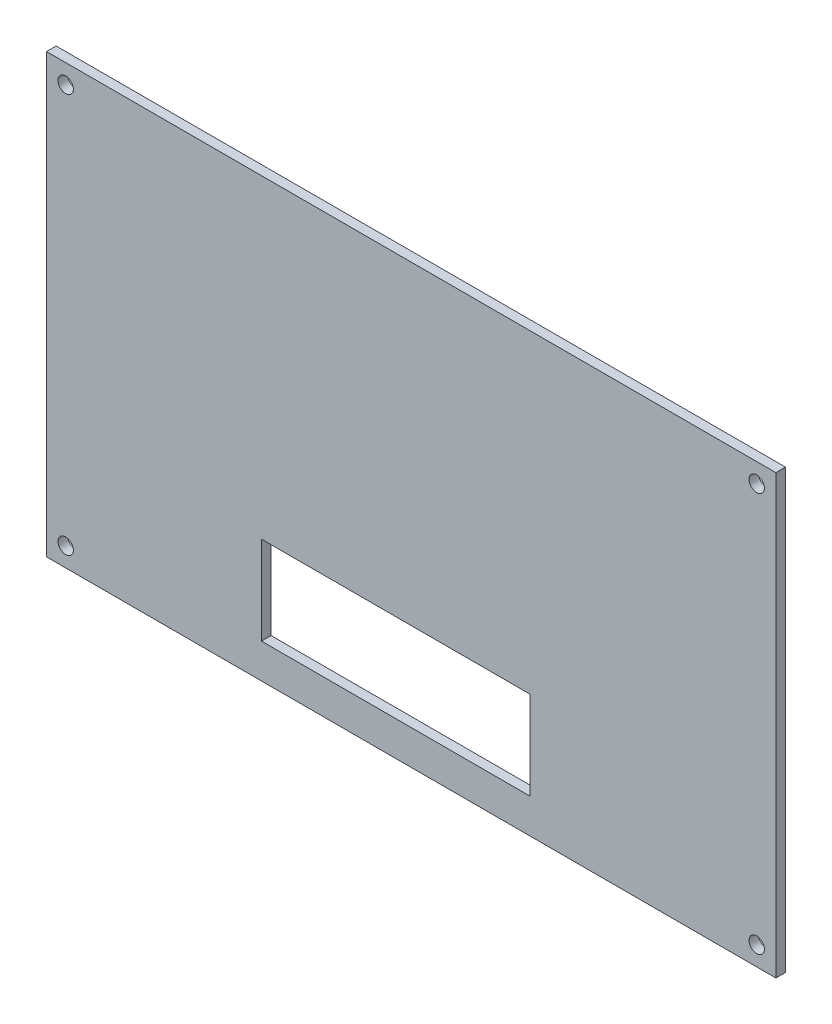
ISO-10303-21;
HEADER;
FILE_DESCRIPTION(('STEP AP214'),'2;1');
FILE_NAME('part.step','',(''),(''),'','','');
FILE_SCHEMA(('AUTOMOTIVE_DESIGN { 1 0 10303 214 1 1 1 1 }'));
ENDSEC;
DATA;
#1=APPLICATION_CONTEXT('core data for automotive mechanical design processes');
#2=APPLICATION_PROTOCOL_DEFINITION('international standard','automotive_design',2000,#1);
#3=PRODUCT_CONTEXT('',#1,'mechanical');
#4=PRODUCT('Part','Part','',(#3));
#5=PRODUCT_RELATED_PRODUCT_CATEGORY('part','',(#4));
#6=PRODUCT_DEFINITION_FORMATION('','',#4);
#7=PRODUCT_DEFINITION_CONTEXT('part definition',#1,'design');
#8=PRODUCT_DEFINITION('design','',#6,#7);
#9=PRODUCT_DEFINITION_SHAPE('','',#8);
#10=(LENGTH_UNIT() NAMED_UNIT(*) SI_UNIT(.MILLI.,.METRE.));
#11=(NAMED_UNIT(*) PLANE_ANGLE_UNIT() SI_UNIT($,.RADIAN.));
#12=(NAMED_UNIT(*) SI_UNIT($,.STERADIAN.) SOLID_ANGLE_UNIT());
#13=UNCERTAINTY_MEASURE_WITH_UNIT(LENGTH_MEASURE(1.E-05),#10,'distance_accuracy_value','');
#14=(GEOMETRIC_REPRESENTATION_CONTEXT(3) GLOBAL_UNCERTAINTY_ASSIGNED_CONTEXT((#13)) GLOBAL_UNIT_ASSIGNED_CONTEXT((#10,
#11,#12)) REPRESENTATION_CONTEXT('',''));
#15=CARTESIAN_POINT('',(0.,0.,0.));
#16=DIRECTION('',(0.,0.,1.));
#17=DIRECTION('',(1.,0.,0.));
#18=AXIS2_PLACEMENT_3D('',#15,#16,#17);
#19=CARTESIAN_POINT('',(95.,-57.,2.5));
#20=DIRECTION('',(-1.,0.,0.));
#21=DIRECTION('',(0.,0.,1.));
#22=AXIS2_PLACEMENT_3D('',#19,#20,#21);
#23=PLANE('',#22);
#24=DIRECTION('',(0.,1.,0.));
#25=VECTOR('',#24,1.);
#26=CARTESIAN_POINT('',(95.,-57.,0.));
#27=LINE('',#26,#25);
#28=CARTESIAN_POINT('',(95.,-57.,0.));
#29=VERTEX_POINT('',#28);
#30=CARTESIAN_POINT('',(95.,57.,0.));
#31=VERTEX_POINT('',#30);
#32=EDGE_CURVE('E124',#29,#31,#27,.T.);
#33=ORIENTED_EDGE('',*,*,#32,.T.);
#34=DIRECTION('',(0.,0.,-1.));
#35=VECTOR('',#34,1.);
#36=CARTESIAN_POINT('',(95.,57.,2.5));
#37=LINE('',#36,#35);
#38=CARTESIAN_POINT('',(95.,57.,2.5));
#39=VERTEX_POINT('',#38);
#40=EDGE_CURVE('E153',#39,#31,#37,.T.);
#41=ORIENTED_EDGE('',*,*,#40,.F.);
#42=DIRECTION('',(0.,1.,0.));
#43=VECTOR('',#42,1.);
#44=CARTESIAN_POINT('',(95.,-57.,2.5));
#45=LINE('',#44,#43);
#46=CARTESIAN_POINT('',(95.,-57.,2.5));
#47=VERTEX_POINT('',#46);
#48=EDGE_CURVE('E127',#47,#39,#45,.T.);
#49=ORIENTED_EDGE('',*,*,#48,.F.);
#50=DIRECTION('',(0.,0.,-1.));
#51=VECTOR('',#50,1.);
#52=CARTESIAN_POINT('',(95.,-57.,2.5));
#53=LINE('',#52,#51);
#54=EDGE_CURVE('E137',#47,#29,#53,.T.);
#55=ORIENTED_EDGE('',*,*,#54,.T.);
#56=EDGE_LOOP('',(#33,#41,#49,#55));
#57=FACE_BOUND('',#56,.T.);
#58=ADVANCED_FACE('F33',(#57),#23,.F.);
#59=CARTESIAN_POINT('',(-95.,57.,2.5));
#60=DIRECTION('',(0.,-1.,0.));
#61=DIRECTION('',(0.,0.,-1.));
#62=AXIS2_PLACEMENT_3D('',#59,#60,#61);
#63=PLANE('',#62);
#64=DIRECTION('',(-1.,0.,0.));
#65=VECTOR('',#64,1.);
#66=CARTESIAN_POINT('',(-95.,57.,0.));
#67=LINE('',#66,#65);
#68=CARTESIAN_POINT('',(-95.,57.,0.));
#69=VERTEX_POINT('',#68);
#70=EDGE_CURVE('E140',#31,#69,#67,.T.);
#71=ORIENTED_EDGE('',*,*,#70,.T.);
#72=DIRECTION('',(0.,0.,-1.));
#73=VECTOR('',#72,1.);
#74=CARTESIAN_POINT('',(-95.,57.,2.5));
#75=LINE('',#74,#73);
#76=CARTESIAN_POINT('',(-95.,57.,2.5));
#77=VERTEX_POINT('',#76);
#78=EDGE_CURVE('E150',#77,#69,#75,.T.);
#79=ORIENTED_EDGE('',*,*,#78,.F.);
#80=DIRECTION('',(-1.,0.,0.));
#81=VECTOR('',#80,1.);
#82=CARTESIAN_POINT('',(-95.,57.,2.5));
#83=LINE('',#82,#81);
#84=EDGE_CURVE('E130',#39,#77,#83,.T.);
#85=ORIENTED_EDGE('',*,*,#84,.F.);
#86=ORIENTED_EDGE('',*,*,#40,.T.);
#87=EDGE_LOOP('',(#71,#79,#85,#86));
#88=FACE_BOUND('',#87,.T.);
#89=ADVANCED_FACE('F211',(#88),#63,.F.);
#90=CARTESIAN_POINT('',(-95.,-57.,2.5));
#91=DIRECTION('',(1.,0.,0.));
#92=DIRECTION('',(0.,0.,-1.));
#93=AXIS2_PLACEMENT_3D('',#90,#91,#92);
#94=PLANE('',#93);
#95=DIRECTION('',(0.,-1.,0.));
#96=VECTOR('',#95,1.);
#97=CARTESIAN_POINT('',(-95.,-57.,0.));
#98=LINE('',#97,#96);
#99=CARTESIAN_POINT('',(-95.,-57.,0.));
#100=VERTEX_POINT('',#99);
#101=EDGE_CURVE('E142',#69,#100,#98,.T.);
#102=ORIENTED_EDGE('',*,*,#101,.T.);
#103=DIRECTION('',(0.,0.,-1.));
#104=VECTOR('',#103,1.);
#105=CARTESIAN_POINT('',(-95.,-57.,2.5));
#106=LINE('',#105,#104);
#107=CARTESIAN_POINT('',(-95.,-57.,2.5));
#108=VERTEX_POINT('',#107);
#109=EDGE_CURVE('E147',#108,#100,#106,.T.);
#110=ORIENTED_EDGE('',*,*,#109,.F.);
#111=DIRECTION('',(0.,-1.,0.));
#112=VECTOR('',#111,1.);
#113=CARTESIAN_POINT('',(-95.,-57.,2.5));
#114=LINE('',#113,#112);
#115=EDGE_CURVE('E133',#77,#108,#114,.T.);
#116=ORIENTED_EDGE('',*,*,#115,.F.);
#117=ORIENTED_EDGE('',*,*,#78,.T.);
#118=EDGE_LOOP('',(#102,#110,#116,#117));
#119=FACE_BOUND('',#118,.T.);
#120=ADVANCED_FACE('F216',(#119),#94,.F.);
#121=CARTESIAN_POINT('',(-95.,-57.,2.5));
#122=DIRECTION('',(0.,1.,0.));
#123=DIRECTION('',(0.,0.,1.));
#124=AXIS2_PLACEMENT_3D('',#121,#122,#123);
#125=PLANE('',#124);
#126=DIRECTION('',(1.,0.,0.));
#127=VECTOR('',#126,1.);
#128=CARTESIAN_POINT('',(-95.,-57.,0.));
#129=LINE('',#128,#127);
#130=EDGE_CURVE('E131',#100,#29,#129,.T.);
#131=ORIENTED_EDGE('',*,*,#130,.T.);
#132=ORIENTED_EDGE('',*,*,#54,.F.);
#133=DIRECTION('',(1.,0.,0.));
#134=VECTOR('',#133,1.);
#135=CARTESIAN_POINT('',(-95.,-57.,2.5));
#136=LINE('',#135,#134);
#137=EDGE_CURVE('E135',#108,#47,#136,.T.);
#138=ORIENTED_EDGE('',*,*,#137,.F.);
#139=ORIENTED_EDGE('',*,*,#109,.T.);
#140=EDGE_LOOP('',(#131,#132,#138,#139));
#141=FACE_BOUND('',#140,.T.);
#142=ADVANCED_FACE('F191',(#141),#125,.F.);
#143=CARTESIAN_POINT('',(0.,0.,2.5));
#144=DIRECTION('',(0.,0.,-1.));
#145=DIRECTION('',(-1.,0.,0.));
#146=AXIS2_PLACEMENT_3D('',#143,#144,#145);
#147=PLANE('',#146);
#148=CARTESIAN_POINT('',(90.,52.,2.5));
#149=DIRECTION('',(0.,0.,1.));
#150=DIRECTION('',(-1.,0.,0.));
#151=AXIS2_PLACEMENT_3D('',#148,#149,#150);
#152=CIRCLE('',#151,2.);
#153=CARTESIAN_POINT('',(88.,52.,2.5));
#154=VERTEX_POINT('',#153);
#155=EDGE_CURVE('E177',#154,#154,#152,.T.);
#156=ORIENTED_EDGE('',*,*,#155,.F.);
#157=EDGE_LOOP('',(#156));
#158=FACE_BOUND('',#157,.T.);
#159=CARTESIAN_POINT('',(90.,-52.,2.5));
#160=DIRECTION('',(0.,0.,1.));
#161=DIRECTION('',(-1.,0.,0.));
#162=AXIS2_PLACEMENT_3D('',#159,#160,#161);
#163=CIRCLE('',#162,2.);
#164=CARTESIAN_POINT('',(88.,-52.,2.5));
#165=VERTEX_POINT('',#164);
#166=EDGE_CURVE('E180',#165,#165,#163,.T.);
#167=ORIENTED_EDGE('',*,*,#166,.F.);
#168=EDGE_LOOP('',(#167));
#169=FACE_BOUND('',#168,.T.);
#170=CARTESIAN_POINT('',(-90.,-52.,2.5));
#171=DIRECTION('',(0.,0.,1.));
#172=DIRECTION('',(1.,0.,0.));
#173=AXIS2_PLACEMENT_3D('',#170,#171,#172);
#174=CIRCLE('',#173,2.);
#175=CARTESIAN_POINT('',(-88.,-52.,2.5));
#176=VERTEX_POINT('',#175);
#177=EDGE_CURVE('E176',#176,#176,#174,.T.);
#178=ORIENTED_EDGE('',*,*,#177,.F.);
#179=EDGE_LOOP('',(#178));
#180=FACE_BOUND('',#179,.T.);
#181=CARTESIAN_POINT('',(-90.,52.,2.5));
#182=DIRECTION('',(0.,0.,1.));
#183=DIRECTION('',(1.,0.,0.));
#184=AXIS2_PLACEMENT_3D('',#181,#182,#183);
#185=CIRCLE('',#184,2.);
#186=CARTESIAN_POINT('',(-88.,52.,2.5));
#187=VERTEX_POINT('',#186);
#188=EDGE_CURVE('E164',#187,#187,#185,.T.);
#189=ORIENTED_EDGE('',*,*,#188,.F.);
#190=EDGE_LOOP('',(#189));
#191=FACE_BOUND('',#190,.T.);
#192=DIRECTION('',(-1.,0.,0.));
#193=VECTOR('',#192,1.);
#194=CARTESIAN_POINT('',(-39.,-25.,2.5));
#195=LINE('',#194,#193);
#196=CARTESIAN_POINT('',(31.,-25.,2.5));
#197=VERTEX_POINT('',#196);
#198=CARTESIAN_POINT('',(-39.,-25.,2.5));
#199=VERTEX_POINT('',#198);
#200=EDGE_CURVE('E110',#197,#199,#195,.T.);
#201=ORIENTED_EDGE('',*,*,#200,.F.);
#202=DIRECTION('',(0.,1.,0.));
#203=VECTOR('',#202,1.);
#204=CARTESIAN_POINT('',(31.,-25.,2.5));
#205=LINE('',#204,#203);
#206=CARTESIAN_POINT('',(31.,-48.,2.5));
#207=VERTEX_POINT('',#206);
#208=EDGE_CURVE('E49',#207,#197,#205,.T.);
#209=ORIENTED_EDGE('',*,*,#208,.F.);
#210=DIRECTION('',(1.,0.,0.));
#211=VECTOR('',#210,1.);
#212=CARTESIAN_POINT('',(-39.,-48.,2.5));
#213=LINE('',#212,#211);
#214=CARTESIAN_POINT('',(-39.,-48.,2.5));
#215=VERTEX_POINT('',#214);
#216=EDGE_CURVE('E117',#215,#207,#213,.T.);
#217=ORIENTED_EDGE('',*,*,#216,.F.);
#218=DIRECTION('',(0.,-1.,0.));
#219=VECTOR('',#218,1.);
#220=CARTESIAN_POINT('',(-39.,-25.,2.5));
#221=LINE('',#220,#219);
#222=EDGE_CURVE('E101',#199,#215,#221,.T.);
#223=ORIENTED_EDGE('',*,*,#222,.F.);
#224=EDGE_LOOP('',(#201,#209,#217,#223));
#225=FACE_BOUND('',#224,.T.);
#226=ORIENTED_EDGE('',*,*,#48,.T.);
#227=ORIENTED_EDGE('',*,*,#84,.T.);
#228=ORIENTED_EDGE('',*,*,#115,.T.);
#229=ORIENTED_EDGE('',*,*,#137,.T.);
#230=EDGE_LOOP('',(#226,#227,#228,#229));
#231=FACE_BOUND('',#230,.T.);
#232=ADVANCED_FACE('F114',(#158,#169,#180,#191,#225,#231),#147,.F.);
#233=CARTESIAN_POINT('',(0.,0.,0.));
#234=DIRECTION('',(0.,0.,-1.));
#235=DIRECTION('',(-1.,0.,0.));
#236=AXIS2_PLACEMENT_3D('',#233,#234,#235);
#237=PLANE('',#236);
#238=CARTESIAN_POINT('',(90.,52.,0.));
#239=DIRECTION('',(0.,0.,-1.));
#240=DIRECTION('',(-1.,0.,0.));
#241=AXIS2_PLACEMENT_3D('',#238,#239,#240);
#242=CIRCLE('',#241,2.);
#243=CARTESIAN_POINT('',(88.,52.,0.));
#244=VERTEX_POINT('',#243);
#245=EDGE_CURVE('E36',#244,#244,#242,.T.);
#246=ORIENTED_EDGE('',*,*,#245,.F.);
#247=EDGE_LOOP('',(#246));
#248=FACE_BOUND('',#247,.T.);
#249=CARTESIAN_POINT('',(90.,-52.,0.));
#250=DIRECTION('',(0.,0.,-1.));
#251=DIRECTION('',(-1.,0.,0.));
#252=AXIS2_PLACEMENT_3D('',#249,#250,#251);
#253=CIRCLE('',#252,2.);
#254=CARTESIAN_POINT('',(88.,-52.,0.));
#255=VERTEX_POINT('',#254);
#256=EDGE_CURVE('E166',#255,#255,#253,.T.);
#257=ORIENTED_EDGE('',*,*,#256,.F.);
#258=EDGE_LOOP('',(#257));
#259=FACE_BOUND('',#258,.T.);
#260=CARTESIAN_POINT('',(-90.,-52.,0.));
#261=DIRECTION('',(0.,0.,-1.));
#262=DIRECTION('',(-1.,0.,0.));
#263=AXIS2_PLACEMENT_3D('',#260,#261,#262);
#264=CIRCLE('',#263,2.);
#265=CARTESIAN_POINT('',(-92.,-52.,0.));
#266=VERTEX_POINT('',#265);
#267=EDGE_CURVE('E163',#266,#266,#264,.T.);
#268=ORIENTED_EDGE('',*,*,#267,.F.);
#269=EDGE_LOOP('',(#268));
#270=FACE_BOUND('',#269,.T.);
#271=CARTESIAN_POINT('',(-90.,52.,0.));
#272=DIRECTION('',(0.,0.,-1.));
#273=DIRECTION('',(-1.,0.,0.));
#274=AXIS2_PLACEMENT_3D('',#271,#272,#273);
#275=CIRCLE('',#274,2.);
#276=CARTESIAN_POINT('',(-92.,52.,0.));
#277=VERTEX_POINT('',#276);
#278=EDGE_CURVE('E160',#277,#277,#275,.T.);
#279=ORIENTED_EDGE('',*,*,#278,.F.);
#280=EDGE_LOOP('',(#279));
#281=FACE_BOUND('',#280,.T.);
#282=DIRECTION('',(0.,-1.,0.));
#283=VECTOR('',#282,1.);
#284=CARTESIAN_POINT('',(31.,0.,0.));
#285=LINE('',#284,#283);
#286=CARTESIAN_POINT('',(31.,-25.,0.));
#287=VERTEX_POINT('',#286);
#288=CARTESIAN_POINT('',(31.,-48.,0.));
#289=VERTEX_POINT('',#288);
#290=EDGE_CURVE('E11',#287,#289,#285,.T.);
#291=ORIENTED_EDGE('',*,*,#290,.F.);
#292=DIRECTION('',(1.,0.,0.));
#293=VECTOR('',#292,1.);
#294=CARTESIAN_POINT('',(0.,-25.,0.));
#295=LINE('',#294,#293);
#296=CARTESIAN_POINT('',(-39.,-25.,0.));
#297=VERTEX_POINT('',#296);
#298=EDGE_CURVE('E156',#297,#287,#295,.T.);
#299=ORIENTED_EDGE('',*,*,#298,.F.);
#300=DIRECTION('',(0.,1.,0.));
#301=VECTOR('',#300,1.);
#302=CARTESIAN_POINT('',(-39.,0.,0.));
#303=LINE('',#302,#301);
#304=CARTESIAN_POINT('',(-39.,-48.,0.));
#305=VERTEX_POINT('',#304);
#306=EDGE_CURVE('E104',#305,#297,#303,.T.);
#307=ORIENTED_EDGE('',*,*,#306,.F.);
#308=DIRECTION('',(-1.,0.,0.));
#309=VECTOR('',#308,1.);
#310=CARTESIAN_POINT('',(0.,-48.,0.));
#311=LINE('',#310,#309);
#312=EDGE_CURVE('E41',#289,#305,#311,.T.);
#313=ORIENTED_EDGE('',*,*,#312,.F.);
#314=EDGE_LOOP('',(#291,#299,#307,#313));
#315=FACE_BOUND('',#314,.T.);
#316=ORIENTED_EDGE('',*,*,#32,.F.);
#317=ORIENTED_EDGE('',*,*,#130,.F.);
#318=ORIENTED_EDGE('',*,*,#101,.F.);
#319=ORIENTED_EDGE('',*,*,#70,.F.);
#320=EDGE_LOOP('',(#316,#317,#318,#319));
#321=FACE_BOUND('',#320,.T.);
#322=ADVANCED_FACE('F190',(#248,#259,#270,#281,#315,#321),#237,.T.);
#323=CARTESIAN_POINT('',(31.,-25.,-7.5));
#324=DIRECTION('',(1.,0.,0.));
#325=DIRECTION('',(0.,1.,0.));
#326=AXIS2_PLACEMENT_3D('',#323,#324,#325);
#327=PLANE('',#326);
#328=ORIENTED_EDGE('',*,*,#290,.T.);
#329=DIRECTION('',(0.,0.,1.));
#330=VECTOR('',#329,1.);
#331=CARTESIAN_POINT('',(31.,-48.,-7.5));
#332=LINE('',#331,#330);
#333=EDGE_CURVE('E122',#289,#207,#332,.T.);
#334=ORIENTED_EDGE('',*,*,#333,.T.);
#335=ORIENTED_EDGE('',*,*,#208,.T.);
#336=DIRECTION('',(0.,0.,1.));
#337=VECTOR('',#336,1.);
#338=CARTESIAN_POINT('',(31.,-25.,-7.5));
#339=LINE('',#338,#337);
#340=EDGE_CURVE('E107',#287,#197,#339,.T.);
#341=ORIENTED_EDGE('',*,*,#340,.F.);
#342=EDGE_LOOP('',(#328,#334,#335,#341));
#343=FACE_BOUND('',#342,.T.);
#344=ADVANCED_FACE('F239',(#343),#327,.F.);
#345=CARTESIAN_POINT('',(-39.,-48.,-7.5));
#346=DIRECTION('',(0.,-1.,0.));
#347=DIRECTION('',(0.,0.,-1.));
#348=AXIS2_PLACEMENT_3D('',#345,#346,#347);
#349=PLANE('',#348);
#350=ORIENTED_EDGE('',*,*,#312,.T.);
#351=DIRECTION('',(0.,0.,1.));
#352=VECTOR('',#351,1.);
#353=CARTESIAN_POINT('',(-39.,-48.,-7.5));
#354=LINE('',#353,#352);
#355=EDGE_CURVE('E106',#305,#215,#354,.T.);
#356=ORIENTED_EDGE('',*,*,#355,.T.);
#357=ORIENTED_EDGE('',*,*,#216,.T.);
#358=ORIENTED_EDGE('',*,*,#333,.F.);
#359=EDGE_LOOP('',(#350,#356,#357,#358));
#360=FACE_BOUND('',#359,.T.);
#361=ADVANCED_FACE('F243',(#360),#349,.F.);
#362=CARTESIAN_POINT('',(-39.,-25.,-7.5));
#363=DIRECTION('',(-1.,0.,0.));
#364=DIRECTION('',(0.,0.,1.));
#365=AXIS2_PLACEMENT_3D('',#362,#363,#364);
#366=PLANE('',#365);
#367=ORIENTED_EDGE('',*,*,#306,.T.);
#368=DIRECTION('',(0.,0.,1.));
#369=VECTOR('',#368,1.);
#370=CARTESIAN_POINT('',(-39.,-25.,-7.5));
#371=LINE('',#370,#369);
#372=EDGE_CURVE('E57',#297,#199,#371,.T.);
#373=ORIENTED_EDGE('',*,*,#372,.T.);
#374=ORIENTED_EDGE('',*,*,#222,.T.);
#375=ORIENTED_EDGE('',*,*,#355,.F.);
#376=EDGE_LOOP('',(#367,#373,#374,#375));
#377=FACE_BOUND('',#376,.T.);
#378=ADVANCED_FACE('F98',(#377),#366,.F.);
#379=CARTESIAN_POINT('',(-39.,-25.,-7.5));
#380=DIRECTION('',(0.,1.,0.));
#381=DIRECTION('',(0.,0.,1.));
#382=AXIS2_PLACEMENT_3D('',#379,#380,#381);
#383=PLANE('',#382);
#384=ORIENTED_EDGE('',*,*,#298,.T.);
#385=ORIENTED_EDGE('',*,*,#340,.T.);
#386=ORIENTED_EDGE('',*,*,#200,.T.);
#387=ORIENTED_EDGE('',*,*,#372,.F.);
#388=EDGE_LOOP('',(#384,#385,#386,#387));
#389=FACE_BOUND('',#388,.T.);
#390=ADVANCED_FACE('F111',(#389),#383,.F.);
#391=CARTESIAN_POINT('',(-90.,52.,-7.5));
#392=DIRECTION('',(0.,0.,1.));
#393=DIRECTION('',(1.,0.,0.));
#394=AXIS2_PLACEMENT_3D('',#391,#392,#393);
#395=CYLINDRICAL_SURFACE('',#394,2.);
#396=ORIENTED_EDGE('',*,*,#278,.T.);
#397=EDGE_LOOP('',(#396));
#398=FACE_BOUND('',#397,.T.);
#399=ORIENTED_EDGE('',*,*,#188,.T.);
#400=EDGE_LOOP('',(#399));
#401=FACE_BOUND('',#400,.T.);
#402=ADVANCED_FACE('F196',(#398,#401),#395,.F.);
#403=CARTESIAN_POINT('',(-90.,-52.,-7.5));
#404=DIRECTION('',(0.,0.,1.));
#405=DIRECTION('',(1.,0.,0.));
#406=AXIS2_PLACEMENT_3D('',#403,#404,#405);
#407=CYLINDRICAL_SURFACE('',#406,2.);
#408=ORIENTED_EDGE('',*,*,#267,.T.);
#409=EDGE_LOOP('',(#408));
#410=FACE_BOUND('',#409,.T.);
#411=ORIENTED_EDGE('',*,*,#177,.T.);
#412=EDGE_LOOP('',(#411));
#413=FACE_BOUND('',#412,.T.);
#414=ADVANCED_FACE('F186',(#410,#413),#407,.F.);
#415=CARTESIAN_POINT('',(90.,-52.,-7.5));
#416=DIRECTION('',(0.,0.,1.));
#417=DIRECTION('',(1.,0.,0.));
#418=AXIS2_PLACEMENT_3D('',#415,#416,#417);
#419=CYLINDRICAL_SURFACE('',#418,2.);
#420=ORIENTED_EDGE('',*,*,#256,.T.);
#421=EDGE_LOOP('',(#420));
#422=FACE_BOUND('',#421,.T.);
#423=ORIENTED_EDGE('',*,*,#166,.T.);
#424=EDGE_LOOP('',(#423));
#425=FACE_BOUND('',#424,.T.);
#426=ADVANCED_FACE('F204',(#422,#425),#419,.F.);
#427=CARTESIAN_POINT('',(90.,52.,-7.5));
#428=DIRECTION('',(0.,0.,1.));
#429=DIRECTION('',(1.,0.,0.));
#430=AXIS2_PLACEMENT_3D('',#427,#428,#429);
#431=CYLINDRICAL_SURFACE('',#430,2.);
#432=ORIENTED_EDGE('',*,*,#245,.T.);
#433=EDGE_LOOP('',(#432));
#434=FACE_BOUND('',#433,.T.);
#435=ORIENTED_EDGE('',*,*,#155,.T.);
#436=EDGE_LOOP('',(#435));
#437=FACE_BOUND('',#436,.T.);
#438=ADVANCED_FACE('F297',(#434,#437),#431,.F.);
#439=CLOSED_SHELL('',(#58,#89,#120,#142,#232,#322,#344,#361,#378,#390,#402,#414,#426,#438));
#440=MANIFOLD_SOLID_BREP('B2',#439);
#441=ADVANCED_BREP_SHAPE_REPRESENTATION('',(#18,#440),#14);
#442=SHAPE_DEFINITION_REPRESENTATION(#9,#441);
ENDSEC;
END-ISO-10303-21;
